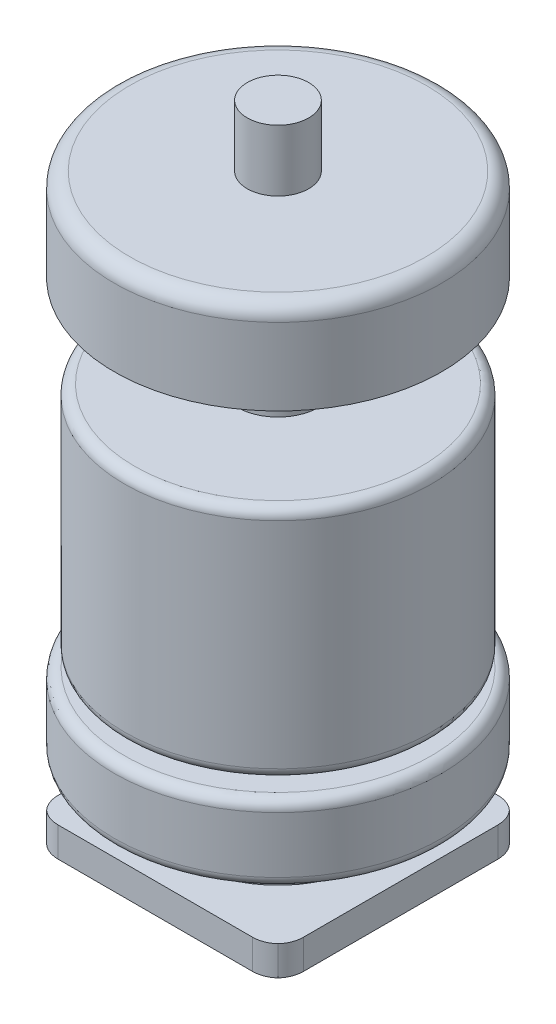
ISO-10303-21;
HEADER;
FILE_DESCRIPTION(('STEP AP214'),'2;1');
FILE_NAME('part.step','',(''),(''),'','','');
FILE_SCHEMA(('AUTOMOTIVE_DESIGN { 1 0 10303 214 1 1 1 1 }'));
ENDSEC;
DATA;
#1=APPLICATION_CONTEXT('core data for automotive mechanical design processes');
#2=APPLICATION_PROTOCOL_DEFINITION('international standard','automotive_design',2000,#1);
#3=PRODUCT_CONTEXT('',#1,'mechanical');
#4=PRODUCT('Part','Part','',(#3));
#5=PRODUCT_RELATED_PRODUCT_CATEGORY('part','',(#4));
#6=PRODUCT_DEFINITION_FORMATION('','',#4);
#7=PRODUCT_DEFINITION_CONTEXT('part definition',#1,'design');
#8=PRODUCT_DEFINITION('design','',#6,#7);
#9=PRODUCT_DEFINITION_SHAPE('','',#8);
#10=(LENGTH_UNIT() NAMED_UNIT(*) SI_UNIT(.MILLI.,.METRE.));
#11=(NAMED_UNIT(*) PLANE_ANGLE_UNIT() SI_UNIT($,.RADIAN.));
#12=(NAMED_UNIT(*) SI_UNIT($,.STERADIAN.) SOLID_ANGLE_UNIT());
#13=UNCERTAINTY_MEASURE_WITH_UNIT(LENGTH_MEASURE(1.E-05),#10,'distance_accuracy_value','');
#14=(GEOMETRIC_REPRESENTATION_CONTEXT(3) GLOBAL_UNCERTAINTY_ASSIGNED_CONTEXT((#13)) GLOBAL_UNIT_ASSIGNED_CONTEXT((#10,
#11,#12)) REPRESENTATION_CONTEXT('',''));
#15=CARTESIAN_POINT('',(0.,0.,0.));
#16=DIRECTION('',(0.,0.,1.));
#17=DIRECTION('',(1.,0.,0.));
#18=AXIS2_PLACEMENT_3D('',#15,#16,#17);
#19=CARTESIAN_POINT('',(4.,7.34943581025671,10.));
#20=DIRECTION('',(0.,1.,0.));
#21=DIRECTION('',(0.,0.,1.));
#22=AXIS2_PLACEMENT_3D('',#19,#20,#21);
#23=PLANE('',#22);
#24=CARTESIAN_POINT('',(0.,7.34943581025671,10.));
#25=DIRECTION('',(0.,1.,0.));
#26=DIRECTION('',(0.,0.,1.));
#27=AXIS2_PLACEMENT_3D('',#24,#25,#26);
#28=CIRCLE('',#27,14.);
#29=CARTESIAN_POINT('',(0.,7.34943581025671,24.));
#30=VERTEX_POINT('',#29);
#31=EDGE_CURVE('E52',#30,#30,#28,.T.);
#32=ORIENTED_EDGE('',*,*,#31,.T.);
#33=EDGE_LOOP('',(#32));
#34=FACE_BOUND('',#33,.T.);
#35=CARTESIAN_POINT('',(0.,7.3494358102567,10.));
#36=DIRECTION('',(0.,1.,0.));
#37=DIRECTION('',(0.,0.,1.));
#38=AXIS2_PLACEMENT_3D('',#35,#36,#37);
#39=CIRCLE('',#38,4.);
#40=CARTESIAN_POINT('',(0.,7.3494358102567,14.));
#41=VERTEX_POINT('',#40);
#42=EDGE_CURVE('E430',#41,#41,#39,.T.);
#43=ORIENTED_EDGE('',*,*,#42,.F.);
#44=EDGE_LOOP('',(#43));
#45=FACE_BOUND('',#44,.T.);
#46=ADVANCED_FACE('F43',(#34,#45),#23,.T.);
#47=CARTESIAN_POINT('',(0.,55.,10.));
#48=DIRECTION('',(0.,1.,0.));
#49=DIRECTION('',(0.,0.,1.));
#50=AXIS2_PLACEMENT_3D('',#47,#48,#49);
#51=CYLINDRICAL_SURFACE('',#50,4.);
#52=ORIENTED_EDGE('',*,*,#42,.T.);
#53=EDGE_LOOP('',(#52));
#54=FACE_BOUND('',#53,.T.);
#55=CARTESIAN_POINT('',(0.,16.3494358102567,10.));
#56=DIRECTION('',(0.,1.,0.));
#57=DIRECTION('',(0.,0.,1.));
#58=AXIS2_PLACEMENT_3D('',#55,#56,#57);
#59=CIRCLE('',#58,4.);
#60=CARTESIAN_POINT('',(0.,16.3494358102567,14.));
#61=VERTEX_POINT('',#60);
#62=EDGE_CURVE('E258',#61,#61,#59,.T.);
#63=ORIENTED_EDGE('',*,*,#62,.F.);
#64=EDGE_LOOP('',(#63));
#65=FACE_BOUND('',#64,.T.);
#66=ADVANCED_FACE('F315',(#54,#65),#51,.T.);
#67=CARTESIAN_POINT('',(4.,16.3494358102567,10.));
#68=DIRECTION('',(0.,-1.,0.));
#69=DIRECTION('',(0.,0.,-1.));
#70=AXIS2_PLACEMENT_3D('',#67,#68,#69);
#71=PLANE('',#70);
#72=CARTESIAN_POINT('',(0.,16.3494358102567,10.));
#73=DIRECTION('',(0.,-1.,0.));
#74=DIRECTION('',(0.,0.,-1.));
#75=AXIS2_PLACEMENT_3D('',#72,#73,#74);
#76=CIRCLE('',#75,16.);
#77=CARTESIAN_POINT('',(0.,16.3494358102567,-6.));
#78=VERTEX_POINT('',#77);
#79=EDGE_CURVE('E254',#78,#78,#76,.F.);
#80=ORIENTED_EDGE('',*,*,#79,.F.);
#81=EDGE_LOOP('',(#80));
#82=FACE_BOUND('',#81,.T.);
#83=ORIENTED_EDGE('',*,*,#62,.T.);
#84=EDGE_LOOP('',(#83));
#85=FACE_BOUND('',#84,.T.);
#86=ADVANCED_FACE('F320',(#82,#85),#71,.T.);
#87=CARTESIAN_POINT('',(0.,31.3494358102567,0.));
#88=DIRECTION('',(0.,-1.,0.));
#89=DIRECTION('',(0.,0.,-1.));
#90=AXIS2_PLACEMENT_3D('',#87,#88,#89);
#91=PLANE('',#90);
#92=CARTESIAN_POINT('',(0.,31.3494358102567,10.));
#93=DIRECTION('',(0.,1.,0.));
#94=DIRECTION('',(0.,0.,1.));
#95=AXIS2_PLACEMENT_3D('',#92,#93,#94);
#96=CIRCLE('',#95,3.);
#97=CARTESIAN_POINT('',(0.,31.3494358102567,13.));
#98=VERTEX_POINT('',#97);
#99=EDGE_CURVE('E172',#98,#98,#96,.T.);
#100=ORIENTED_EDGE('',*,*,#99,.T.);
#101=EDGE_LOOP('',(#100));
#102=FACE_BOUND('',#101,.T.);
#103=ADVANCED_FACE('F326',(#102),#91,.F.);
#104=CARTESIAN_POINT('',(0.,55.,10.));
#105=DIRECTION('',(0.,1.,0.));
#106=DIRECTION('',(0.,0.,1.));
#107=AXIS2_PLACEMENT_3D('',#104,#105,#106);
#108=CYLINDRICAL_SURFACE('',#107,3.);
#109=ORIENTED_EDGE('',*,*,#99,.F.);
#110=EDGE_LOOP('',(#109));
#111=FACE_BOUND('',#110,.T.);
#112=CARTESIAN_POINT('',(0.,25.3494358102567,10.));
#113=DIRECTION('',(0.,1.,0.));
#114=DIRECTION('',(0.,0.,1.));
#115=AXIS2_PLACEMENT_3D('',#112,#113,#114);
#116=CIRCLE('',#115,3.);
#117=CARTESIAN_POINT('',(0.,25.3494358102567,13.));
#118=VERTEX_POINT('',#117);
#119=EDGE_CURVE('E165',#118,#118,#116,.T.);
#120=ORIENTED_EDGE('',*,*,#119,.T.);
#121=EDGE_LOOP('',(#120));
#122=FACE_BOUND('',#121,.T.);
#123=ADVANCED_FACE('F365',(#111,#122),#108,.T.);
#124=CARTESIAN_POINT('',(-3.,25.3494358102567,10.));
#125=DIRECTION('',(0.,-1.,0.));
#126=DIRECTION('',(0.,0.,-1.));
#127=AXIS2_PLACEMENT_3D('',#124,#125,#126);
#128=PLANE('',#127);
#129=CARTESIAN_POINT('',(0.,25.3494358102567,10.));
#130=DIRECTION('',(0.,-1.,0.));
#131=DIRECTION('',(0.,0.,-1.));
#132=AXIS2_PLACEMENT_3D('',#129,#130,#131);
#133=CIRCLE('',#132,14.5);
#134=CARTESIAN_POINT('',(0.,25.3494358102567,-4.5));
#135=VERTEX_POINT('',#134);
#136=EDGE_CURVE('E237',#135,#135,#133,.F.);
#137=ORIENTED_EDGE('',*,*,#136,.T.);
#138=EDGE_LOOP('',(#137));
#139=FACE_BOUND('',#138,.T.);
#140=ORIENTED_EDGE('',*,*,#119,.F.);
#141=EDGE_LOOP('',(#140));
#142=FACE_BOUND('',#141,.T.);
#143=ADVANCED_FACE('F362',(#139,#142),#128,.F.);
#144=CARTESIAN_POINT('',(0.,31.3494358102567,10.));
#145=DIRECTION('',(0.,1.,0.));
#146=DIRECTION('',(0.,0.,1.));
#147=AXIS2_PLACEMENT_3D('',#144,#145,#146);
#148=CYLINDRICAL_SURFACE('',#147,16.);
#149=CARTESIAN_POINT('',(0.,23.8494358102567,10.));
#150=DIRECTION('',(0.,-1.,0.));
#151=DIRECTION('',(0.,0.,-1.));
#152=AXIS2_PLACEMENT_3D('',#149,#150,#151);
#153=CIRCLE('',#152,16.);
#154=CARTESIAN_POINT('',(0.,23.8494358102567,-6.));
#155=VERTEX_POINT('',#154);
#156=EDGE_CURVE('E262',#155,#155,#153,.T.);
#157=ORIENTED_EDGE('',*,*,#156,.T.);
#158=EDGE_LOOP('',(#157));
#159=FACE_BOUND('',#158,.T.);
#160=ORIENTED_EDGE('',*,*,#79,.T.);
#161=EDGE_LOOP('',(#160));
#162=FACE_BOUND('',#161,.T.);
#163=ADVANCED_FACE('F305',(#159,#162),#148,.T.);
#164=CARTESIAN_POINT('',(0.,55.,10.));
#165=DIRECTION('',(0.,1.,0.));
#166=DIRECTION('',(0.,0.,1.));
#167=AXIS2_PLACEMENT_3D('',#164,#165,#166);
#168=CYLINDRICAL_SURFACE('',#167,15.);
#169=CARTESIAN_POINT('',(0.,6.3494358102567,10.));
#170=DIRECTION('',(0.,1.,0.));
#171=DIRECTION('',(0.,0.,1.));
#172=AXIS2_PLACEMENT_3D('',#169,#170,#171);
#173=CIRCLE('',#172,15.);
#174=CARTESIAN_POINT('',(0.,6.3494358102567,25.));
#175=VERTEX_POINT('',#174);
#176=EDGE_CURVE('E286',#175,#175,#173,.F.);
#177=ORIENTED_EDGE('',*,*,#176,.T.);
#178=EDGE_LOOP('',(#177));
#179=FACE_BOUND('',#178,.T.);
#180=CARTESIAN_POINT('',(0.,-14.6505641897433,10.));
#181=DIRECTION('',(0.,1.,0.));
#182=DIRECTION('',(0.,0.,1.));
#183=AXIS2_PLACEMENT_3D('',#180,#181,#182);
#184=CIRCLE('',#183,15.);
#185=CARTESIAN_POINT('',(0.,-14.6505641897433,25.));
#186=VERTEX_POINT('',#185);
#187=EDGE_CURVE('E282',#186,#186,#184,.T.);
#188=ORIENTED_EDGE('',*,*,#187,.T.);
#189=EDGE_LOOP('',(#188));
#190=FACE_BOUND('',#189,.T.);
#191=ADVANCED_FACE('F301',(#179,#190),#168,.T.);
#192=CARTESIAN_POINT('',(-9.,-15.6505641897433,10.));
#193=DIRECTION('',(0.,1.,0.));
#194=DIRECTION('',(0.,0.,1.));
#195=AXIS2_PLACEMENT_3D('',#192,#193,#194);
#196=PLANE('',#195);
#197=CARTESIAN_POINT('',(0.,-15.6505641897433,10.));
#198=DIRECTION('',(0.,1.,0.));
#199=DIRECTION('',(0.,0.,1.));
#200=AXIS2_PLACEMENT_3D('',#197,#198,#199);
#201=CIRCLE('',#200,14.);
#202=CARTESIAN_POINT('',(0.,-15.6505641897433,24.));
#203=VERTEX_POINT('',#202);
#204=EDGE_CURVE('E11',#203,#203,#201,.F.);
#205=ORIENTED_EDGE('',*,*,#204,.T.);
#206=EDGE_LOOP('',(#205));
#207=FACE_BOUND('',#206,.T.);
#208=CARTESIAN_POINT('',(0.,-15.6505641897433,10.));
#209=DIRECTION('',(0.,1.,0.));
#210=DIRECTION('',(0.,0.,1.));
#211=AXIS2_PLACEMENT_3D('',#208,#209,#210);
#212=CIRCLE('',#211,9.);
#213=CARTESIAN_POINT('',(0.,-15.6505641897433,19.));
#214=VERTEX_POINT('',#213);
#215=EDGE_CURVE('E426',#214,#214,#212,.T.);
#216=ORIENTED_EDGE('',*,*,#215,.T.);
#217=EDGE_LOOP('',(#216));
#218=FACE_BOUND('',#217,.T.);
#219=ADVANCED_FACE('F304',(#207,#218),#196,.F.);
#220=CARTESIAN_POINT('',(0.,55.,10.));
#221=DIRECTION('',(0.,1.,0.));
#222=DIRECTION('',(0.,0.,1.));
#223=AXIS2_PLACEMENT_3D('',#220,#221,#222);
#224=CYLINDRICAL_SURFACE('',#223,9.);
#225=ORIENTED_EDGE('',*,*,#215,.F.);
#226=EDGE_LOOP('',(#225));
#227=FACE_BOUND('',#226,.T.);
#228=CARTESIAN_POINT('',(0.,-16.6505641897433,10.));
#229=DIRECTION('',(0.,1.,0.));
#230=DIRECTION('',(0.,0.,1.));
#231=AXIS2_PLACEMENT_3D('',#228,#229,#230);
#232=CIRCLE('',#231,9.);
#233=CARTESIAN_POINT('',(0.,-16.6505641897433,19.));
#234=VERTEX_POINT('',#233);
#235=EDGE_CURVE('E423',#234,#234,#232,.T.);
#236=ORIENTED_EDGE('',*,*,#235,.T.);
#237=EDGE_LOOP('',(#236));
#238=FACE_BOUND('',#237,.T.);
#239=ADVANCED_FACE('F372',(#227,#238),#224,.T.);
#240=CARTESIAN_POINT('',(0.,-31.6505641897433,0.));
#241=DIRECTION('',(0.,-1.,0.));
#242=DIRECTION('',(0.,0.,-1.));
#243=AXIS2_PLACEMENT_3D('',#240,#241,#242);
#244=PLANE('',#243);
#245=DIRECTION('',(0.,0.,-1.));
#246=VECTOR('',#245,1.);
#247=CARTESIAN_POINT('',(-12.,-31.6505641897433,0.));
#248=LINE('',#247,#246);
#249=CARTESIAN_POINT('',(-12.,-31.6505641897433,19.5078914592038));
#250=VERTEX_POINT('',#249);
#251=CARTESIAN_POINT('',(-12.,-31.6505641897433,0.492108540796227));
#252=VERTEX_POINT('',#251);
#253=EDGE_CURVE('E143',#250,#252,#248,.T.);
#254=ORIENTED_EDGE('',*,*,#253,.T.);
#255=CARTESIAN_POINT('',(-9.3,-31.6505641897433,0.492108540796227));
#256=DIRECTION('',(0.,-1.,0.));
#257=DIRECTION('',(0.,0.,-1.));
#258=AXIS2_PLACEMENT_3D('',#255,#256,#257);
#259=CIRCLE('',#258,2.7);
#260=CARTESIAN_POINT('',(-11.3103022768662,-31.6505641897433,-1.3103022768662));
#261=VERTEX_POINT('',#260);
#262=EDGE_CURVE('E191',#252,#261,#259,.T.);
#263=ORIENTED_EDGE('',*,*,#262,.T.);
#264=CARTESIAN_POINT('',(-9.50789145920377,-31.6505641897433,0.699999999999999));
#265=DIRECTION('',(0.,-1.,0.));
#266=DIRECTION('',(0.,0.,-1.));
#267=AXIS2_PLACEMENT_3D('',#264,#265,#266);
#268=CIRCLE('',#267,2.7);
#269=CARTESIAN_POINT('',(-9.50789145920377,-31.6505641897433,-2.));
#270=VERTEX_POINT('',#269);
#271=EDGE_CURVE('E188',#261,#270,#268,.T.);
#272=ORIENTED_EDGE('',*,*,#271,.T.);
#273=DIRECTION('',(-1.,0.,0.));
#274=VECTOR('',#273,1.);
#275=CARTESIAN_POINT('',(0.,-31.6505641897433,-2.));
#276=LINE('',#275,#274);
#277=CARTESIAN_POINT('',(9.50789145920377,-31.6505641897433,-2.));
#278=VERTEX_POINT('',#277);
#279=EDGE_CURVE('E463',#278,#270,#276,.T.);
#280=ORIENTED_EDGE('',*,*,#279,.F.);
#281=CARTESIAN_POINT('',(9.50789145920377,-31.6505641897433,0.699999999999999));
#282=DIRECTION('',(0.,-1.,0.));
#283=DIRECTION('',(0.,0.,-1.));
#284=AXIS2_PLACEMENT_3D('',#281,#282,#283);
#285=CIRCLE('',#284,2.7);
#286=CARTESIAN_POINT('',(11.3103022768662,-31.6505641897433,-1.3103022768662));
#287=VERTEX_POINT('',#286);
#288=EDGE_CURVE('E178',#278,#287,#285,.T.);
#289=ORIENTED_EDGE('',*,*,#288,.T.);
#290=CARTESIAN_POINT('',(9.3,-31.6505641897433,0.492108540796227));
#291=DIRECTION('',(0.,-1.,0.));
#292=DIRECTION('',(0.,0.,-1.));
#293=AXIS2_PLACEMENT_3D('',#290,#291,#292);
#294=CIRCLE('',#293,2.7);
#295=CARTESIAN_POINT('',(12.,-31.6505641897433,0.492108540796227));
#296=VERTEX_POINT('',#295);
#297=EDGE_CURVE('E169',#287,#296,#294,.T.);
#298=ORIENTED_EDGE('',*,*,#297,.T.);
#299=DIRECTION('',(0.,0.,-1.));
#300=VECTOR('',#299,1.);
#301=CARTESIAN_POINT('',(12.,-31.6505641897433,0.));
#302=LINE('',#301,#300);
#303=CARTESIAN_POINT('',(12.,-31.6505641897433,19.5078914592038));
#304=VERTEX_POINT('',#303);
#305=EDGE_CURVE('E456',#304,#296,#302,.T.);
#306=ORIENTED_EDGE('',*,*,#305,.F.);
#307=CARTESIAN_POINT('',(9.3,-31.6505641897433,19.5078914592038));
#308=DIRECTION('',(0.,-1.,0.));
#309=DIRECTION('',(0.,0.,-1.));
#310=AXIS2_PLACEMENT_3D('',#307,#308,#309);
#311=CIRCLE('',#310,2.7);
#312=CARTESIAN_POINT('',(11.3103022768662,-31.6505641897433,21.3103022768662));
#313=VERTEX_POINT('',#312);
#314=EDGE_CURVE('E181',#304,#313,#311,.T.);
#315=ORIENTED_EDGE('',*,*,#314,.T.);
#316=CARTESIAN_POINT('',(9.50789145920377,-31.6505641897433,19.3));
#317=DIRECTION('',(0.,-1.,0.));
#318=DIRECTION('',(0.,0.,-1.));
#319=AXIS2_PLACEMENT_3D('',#316,#317,#318);
#320=CIRCLE('',#319,2.7);
#321=CARTESIAN_POINT('',(9.50789145920377,-31.6505641897433,22.));
#322=VERTEX_POINT('',#321);
#323=EDGE_CURVE('E150',#313,#322,#320,.T.);
#324=ORIENTED_EDGE('',*,*,#323,.T.);
#325=DIRECTION('',(-1.,0.,0.));
#326=VECTOR('',#325,1.);
#327=CARTESIAN_POINT('',(0.,-31.6505641897433,22.));
#328=LINE('',#327,#326);
#329=CARTESIAN_POINT('',(-9.50789145920377,-31.6505641897433,22.));
#330=VERTEX_POINT('',#329);
#331=EDGE_CURVE('E449',#322,#330,#328,.T.);
#332=ORIENTED_EDGE('',*,*,#331,.T.);
#333=CARTESIAN_POINT('',(-9.50789145920377,-31.6505641897433,19.3));
#334=DIRECTION('',(0.,-1.,0.));
#335=DIRECTION('',(0.,0.,-1.));
#336=AXIS2_PLACEMENT_3D('',#333,#334,#335);
#337=CIRCLE('',#336,2.7);
#338=CARTESIAN_POINT('',(-11.3103022768662,-31.6505641897433,21.3103022768662));
#339=VERTEX_POINT('',#338);
#340=EDGE_CURVE('E145',#330,#339,#337,.T.);
#341=ORIENTED_EDGE('',*,*,#340,.T.);
#342=CARTESIAN_POINT('',(-9.3,-31.6505641897433,19.5078914592038));
#343=DIRECTION('',(0.,-1.,0.));
#344=DIRECTION('',(0.,0.,-1.));
#345=AXIS2_PLACEMENT_3D('',#342,#343,#344);
#346=CIRCLE('',#345,2.7);
#347=EDGE_CURVE('E140',#339,#250,#346,.T.);
#348=ORIENTED_EDGE('',*,*,#347,.T.);
#349=EDGE_LOOP('',(#254,#263,#272,#280,#289,#298,#306,#315,#324,#332,#341,#348));
#350=FACE_BOUND('',#349,.T.);
#351=ADVANCED_FACE('F142',(#350),#244,.T.);
#352=CARTESIAN_POINT('',(0.,-28.7505641897433,-2.));
#353=DIRECTION('',(0.,0.,1.));
#354=DIRECTION('',(0.,-1.,0.));
#355=AXIS2_PLACEMENT_3D('',#352,#353,#354);
#356=PLANE('',#355);
#357=ORIENTED_EDGE('',*,*,#279,.T.);
#358=DIRECTION('',(0.,-1.,0.));
#359=VECTOR('',#358,1.);
#360=CARTESIAN_POINT('',(-9.50789145920377,-28.7505641897433,-2.));
#361=LINE('',#360,#359);
#362=CARTESIAN_POINT('',(-9.50789145920377,-28.7505641897433,-2.));
#363=VERTEX_POINT('',#362);
#364=EDGE_CURVE('E220',#270,#363,#361,.F.);
#365=ORIENTED_EDGE('',*,*,#364,.T.);
#366=DIRECTION('',(-1.,0.,0.));
#367=VECTOR('',#366,1.);
#368=CARTESIAN_POINT('',(0.,-28.7505641897433,-2.));
#369=LINE('',#368,#367);
#370=CARTESIAN_POINT('',(9.50789145920377,-28.7505641897433,-2.));
#371=VERTEX_POINT('',#370);
#372=EDGE_CURVE('E460',#371,#363,#369,.T.);
#373=ORIENTED_EDGE('',*,*,#372,.F.);
#374=DIRECTION('',(0.,-1.,0.));
#375=VECTOR('',#374,1.);
#376=CARTESIAN_POINT('',(9.50789145920377,-31.6505641897433,-2.));
#377=LINE('',#376,#375);
#378=EDGE_CURVE('E216',#371,#278,#377,.T.);
#379=ORIENTED_EDGE('',*,*,#378,.T.);
#380=EDGE_LOOP('',(#357,#365,#373,#379));
#381=FACE_BOUND('',#380,.T.);
#382=ADVANCED_FACE('F354',(#381),#356,.F.);
#383=CARTESIAN_POINT('',(9.50789145920377,31.3494358102567,0.700000000000003));
#384=DIRECTION('',(0.,1.,0.));
#385=DIRECTION('',(0.,0.,1.));
#386=AXIS2_PLACEMENT_3D('',#383,#384,#385);
#387=CYLINDRICAL_SURFACE('',#386,2.7);
#388=CARTESIAN_POINT('',(9.50789145920377,-28.7505641897433,0.699999999999999));
#389=DIRECTION('',(0.,-1.,0.));
#390=DIRECTION('',(0.,0.,-1.));
#391=AXIS2_PLACEMENT_3D('',#388,#389,#390);
#392=CIRCLE('',#391,2.7);
#393=CARTESIAN_POINT('',(11.3103022768662,-28.7505641897433,-1.3103022768662));
#394=VERTEX_POINT('',#393);
#395=EDGE_CURVE('E197',#394,#371,#392,.F.);
#396=ORIENTED_EDGE('',*,*,#395,.F.);
#397=DIRECTION('',(0.,1.,0.));
#398=VECTOR('',#397,1.);
#399=CARTESIAN_POINT('',(11.3103022768662,-30.2005641897433,-1.3103022768662));
#400=LINE('',#399,#398);
#401=EDGE_CURVE('E250',#394,#287,#400,.F.);
#402=ORIENTED_EDGE('',*,*,#401,.T.);
#403=ORIENTED_EDGE('',*,*,#288,.F.);
#404=ORIENTED_EDGE('',*,*,#378,.F.);
#405=EDGE_LOOP('',(#396,#402,#403,#404));
#406=FACE_BOUND('',#405,.T.);
#407=ADVANCED_FACE('F357',(#406),#387,.T.);
#408=CARTESIAN_POINT('',(9.3,31.3494358102567,0.492108540796231));
#409=DIRECTION('',(0.,1.,0.));
#410=DIRECTION('',(0.,0.,1.));
#411=AXIS2_PLACEMENT_3D('',#408,#409,#410);
#412=CYLINDRICAL_SURFACE('',#411,2.7);
#413=ORIENTED_EDGE('',*,*,#401,.F.);
#414=CARTESIAN_POINT('',(9.3,-28.7505641897433,0.492108540796227));
#415=DIRECTION('',(0.,-1.,0.));
#416=DIRECTION('',(0.,0.,-1.));
#417=AXIS2_PLACEMENT_3D('',#414,#415,#416);
#418=CIRCLE('',#417,2.7);
#419=CARTESIAN_POINT('',(12.,-28.7505641897433,0.492108540796227));
#420=VERTEX_POINT('',#419);
#421=EDGE_CURVE('E194',#420,#394,#418,.F.);
#422=ORIENTED_EDGE('',*,*,#421,.F.);
#423=DIRECTION('',(0.,-1.,0.));
#424=VECTOR('',#423,1.);
#425=CARTESIAN_POINT('',(12.,-28.7505641897433,0.492108540796227));
#426=LINE('',#425,#424);
#427=EDGE_CURVE('E231',#296,#420,#426,.F.);
#428=ORIENTED_EDGE('',*,*,#427,.F.);
#429=ORIENTED_EDGE('',*,*,#297,.F.);
#430=EDGE_LOOP('',(#413,#422,#428,#429));
#431=FACE_BOUND('',#430,.T.);
#432=ADVANCED_FACE('F352',(#431),#412,.T.);
#433=CARTESIAN_POINT('',(12.,-28.7505641897433,0.));
#434=DIRECTION('',(-1.,0.,0.));
#435=DIRECTION('',(0.,0.,1.));
#436=AXIS2_PLACEMENT_3D('',#433,#434,#435);
#437=PLANE('',#436);
#438=DIRECTION('',(0.,0.,-1.));
#439=VECTOR('',#438,1.);
#440=CARTESIAN_POINT('',(12.,-28.7505641897433,0.));
#441=LINE('',#440,#439);
#442=CARTESIAN_POINT('',(12.,-28.7505641897433,19.5078914592038));
#443=VERTEX_POINT('',#442);
#444=EDGE_CURVE('E452',#443,#420,#441,.T.);
#445=ORIENTED_EDGE('',*,*,#444,.F.);
#446=DIRECTION('',(0.,-1.,0.));
#447=VECTOR('',#446,1.);
#448=CARTESIAN_POINT('',(12.,-31.6505641897433,19.5078914592038));
#449=LINE('',#448,#447);
#450=EDGE_CURVE('E234',#443,#304,#449,.T.);
#451=ORIENTED_EDGE('',*,*,#450,.T.);
#452=ORIENTED_EDGE('',*,*,#305,.T.);
#453=ORIENTED_EDGE('',*,*,#427,.T.);
#454=EDGE_LOOP('',(#445,#451,#452,#453));
#455=FACE_BOUND('',#454,.T.);
#456=ADVANCED_FACE('F348',(#455),#437,.F.);
#457=CARTESIAN_POINT('',(9.3,31.3494358102567,19.5078914592038));
#458=DIRECTION('',(0.,1.,0.));
#459=DIRECTION('',(0.,0.,1.));
#460=AXIS2_PLACEMENT_3D('',#457,#458,#459);
#461=CYLINDRICAL_SURFACE('',#460,2.7);
#462=ORIENTED_EDGE('',*,*,#450,.F.);
#463=CARTESIAN_POINT('',(9.3,-28.7505641897433,19.5078914592038));
#464=DIRECTION('',(0.,-1.,0.));
#465=DIRECTION('',(0.,0.,-1.));
#466=AXIS2_PLACEMENT_3D('',#463,#464,#465);
#467=CIRCLE('',#466,2.7);
#468=CARTESIAN_POINT('',(11.3103022768662,-28.7505641897433,21.3103022768662));
#469=VERTEX_POINT('',#468);
#470=EDGE_CURVE('E200',#469,#443,#467,.F.);
#471=ORIENTED_EDGE('',*,*,#470,.F.);
#472=DIRECTION('',(0.,1.,0.));
#473=VECTOR('',#472,1.);
#474=CARTESIAN_POINT('',(11.3103022768662,-30.2005641897433,21.3103022768662));
#475=LINE('',#474,#473);
#476=EDGE_CURVE('E246',#313,#469,#475,.T.);
#477=ORIENTED_EDGE('',*,*,#476,.F.);
#478=ORIENTED_EDGE('',*,*,#314,.F.);
#479=EDGE_LOOP('',(#462,#471,#477,#478));
#480=FACE_BOUND('',#479,.T.);
#481=ADVANCED_FACE('F351',(#480),#461,.T.);
#482=CARTESIAN_POINT('',(9.50789145920377,31.3494358102567,19.3));
#483=DIRECTION('',(0.,1.,0.));
#484=DIRECTION('',(0.,0.,1.));
#485=AXIS2_PLACEMENT_3D('',#482,#483,#484);
#486=CYLINDRICAL_SURFACE('',#485,2.7);
#487=CARTESIAN_POINT('',(9.50789145920377,-28.7505641897433,19.3));
#488=DIRECTION('',(0.,-1.,0.));
#489=DIRECTION('',(0.,0.,-1.));
#490=AXIS2_PLACEMENT_3D('',#487,#488,#489);
#491=CIRCLE('',#490,2.7);
#492=CARTESIAN_POINT('',(9.50789145920377,-28.7505641897433,22.));
#493=VERTEX_POINT('',#492);
#494=EDGE_CURVE('E203',#493,#469,#491,.F.);
#495=ORIENTED_EDGE('',*,*,#494,.F.);
#496=DIRECTION('',(0.,1.,0.));
#497=VECTOR('',#496,1.);
#498=CARTESIAN_POINT('',(9.50789145920377,-28.7505641897433,22.));
#499=LINE('',#498,#497);
#500=EDGE_CURVE('E223',#322,#493,#499,.T.);
#501=ORIENTED_EDGE('',*,*,#500,.F.);
#502=ORIENTED_EDGE('',*,*,#323,.F.);
#503=ORIENTED_EDGE('',*,*,#476,.T.);
#504=EDGE_LOOP('',(#495,#501,#502,#503));
#505=FACE_BOUND('',#504,.T.);
#506=ADVANCED_FACE('F346',(#505),#486,.T.);
#507=CARTESIAN_POINT('',(0.,-28.7505641897433,22.));
#508=DIRECTION('',(0.,0.,1.));
#509=DIRECTION('',(0.,-1.,0.));
#510=AXIS2_PLACEMENT_3D('',#507,#508,#509);
#511=PLANE('',#510);
#512=DIRECTION('',(-1.,0.,0.));
#513=VECTOR('',#512,1.);
#514=CARTESIAN_POINT('',(0.,-28.7505641897433,22.));
#515=LINE('',#514,#513);
#516=CARTESIAN_POINT('',(-9.50789145920377,-28.7505641897433,22.));
#517=VERTEX_POINT('',#516);
#518=EDGE_CURVE('E445',#493,#517,#515,.T.);
#519=ORIENTED_EDGE('',*,*,#518,.T.);
#520=DIRECTION('',(0.,1.,0.));
#521=VECTOR('',#520,1.);
#522=CARTESIAN_POINT('',(-9.50789145920377,-28.7505641897433,22.));
#523=LINE('',#522,#521);
#524=EDGE_CURVE('E227',#517,#330,#523,.F.);
#525=ORIENTED_EDGE('',*,*,#524,.T.);
#526=ORIENTED_EDGE('',*,*,#331,.F.);
#527=ORIENTED_EDGE('',*,*,#500,.T.);
#528=EDGE_LOOP('',(#519,#525,#526,#527));
#529=FACE_BOUND('',#528,.T.);
#530=ADVANCED_FACE('F342',(#529),#511,.T.);
#531=CARTESIAN_POINT('',(-9.50789145920377,31.3494358102567,19.3));
#532=DIRECTION('',(0.,1.,0.));
#533=DIRECTION('',(0.,0.,1.));
#534=AXIS2_PLACEMENT_3D('',#531,#532,#533);
#535=CYLINDRICAL_SURFACE('',#534,2.7);
#536=CARTESIAN_POINT('',(-9.50789145920377,-28.7505641897433,19.3));
#537=DIRECTION('',(0.,-1.,0.));
#538=DIRECTION('',(0.,0.,-1.));
#539=AXIS2_PLACEMENT_3D('',#536,#537,#538);
#540=CIRCLE('',#539,2.7);
#541=CARTESIAN_POINT('',(-11.3103022768662,-28.7505641897433,21.3103022768662));
#542=VERTEX_POINT('',#541);
#543=EDGE_CURVE('E208',#542,#517,#540,.F.);
#544=ORIENTED_EDGE('',*,*,#543,.F.);
#545=DIRECTION('',(0.,1.,0.));
#546=VECTOR('',#545,1.);
#547=CARTESIAN_POINT('',(-11.3103022768662,-30.2005641897433,21.3103022768662));
#548=LINE('',#547,#546);
#549=EDGE_CURVE('E243',#542,#339,#548,.F.);
#550=ORIENTED_EDGE('',*,*,#549,.T.);
#551=ORIENTED_EDGE('',*,*,#340,.F.);
#552=ORIENTED_EDGE('',*,*,#524,.F.);
#553=EDGE_LOOP('',(#544,#550,#551,#552));
#554=FACE_BOUND('',#553,.T.);
#555=ADVANCED_FACE('F345',(#554),#535,.T.);
#556=CARTESIAN_POINT('',(-9.3,31.3494358102567,19.5078914592038));
#557=DIRECTION('',(0.,1.,0.));
#558=DIRECTION('',(0.,0.,1.));
#559=AXIS2_PLACEMENT_3D('',#556,#557,#558);
#560=CYLINDRICAL_SURFACE('',#559,2.7);
#561=ORIENTED_EDGE('',*,*,#549,.F.);
#562=CARTESIAN_POINT('',(-9.3,-28.7505641897433,19.5078914592038));
#563=DIRECTION('',(0.,-1.,0.));
#564=DIRECTION('',(0.,0.,-1.));
#565=AXIS2_PLACEMENT_3D('',#562,#563,#564);
#566=CIRCLE('',#565,2.7);
#567=CARTESIAN_POINT('',(-12.,-28.7505641897433,19.5078914592038));
#568=VERTEX_POINT('',#567);
#569=EDGE_CURVE('E71',#568,#542,#566,.F.);
#570=ORIENTED_EDGE('',*,*,#569,.F.);
#571=DIRECTION('',(0.,1.,0.));
#572=VECTOR('',#571,1.);
#573=CARTESIAN_POINT('',(-12.,-28.7505641897433,19.5078914592038));
#574=LINE('',#573,#572);
#575=EDGE_CURVE('E156',#250,#568,#574,.T.);
#576=ORIENTED_EDGE('',*,*,#575,.F.);
#577=ORIENTED_EDGE('',*,*,#347,.F.);
#578=EDGE_LOOP('',(#561,#570,#576,#577));
#579=FACE_BOUND('',#578,.T.);
#580=ADVANCED_FACE('F163',(#579),#560,.T.);
#581=CARTESIAN_POINT('',(-12.,-28.7505641897433,0.));
#582=DIRECTION('',(-1.,0.,0.));
#583=DIRECTION('',(0.,0.,1.));
#584=AXIS2_PLACEMENT_3D('',#581,#582,#583);
#585=PLANE('',#584);
#586=DIRECTION('',(0.,0.,-1.));
#587=VECTOR('',#586,1.);
#588=CARTESIAN_POINT('',(-12.,-28.7505641897433,0.));
#589=LINE('',#588,#587);
#590=CARTESIAN_POINT('',(-12.,-28.7505641897433,0.492108540796227));
#591=VERTEX_POINT('',#590);
#592=EDGE_CURVE('E160',#568,#591,#589,.T.);
#593=ORIENTED_EDGE('',*,*,#592,.T.);
#594=DIRECTION('',(0.,1.,0.));
#595=VECTOR('',#594,1.);
#596=CARTESIAN_POINT('',(-12.,-28.7505641897433,0.492108540796227));
#597=LINE('',#596,#595);
#598=EDGE_CURVE('E158',#591,#252,#597,.F.);
#599=ORIENTED_EDGE('',*,*,#598,.T.);
#600=ORIENTED_EDGE('',*,*,#253,.F.);
#601=ORIENTED_EDGE('',*,*,#575,.T.);
#602=EDGE_LOOP('',(#593,#599,#600,#601));
#603=FACE_BOUND('',#602,.T.);
#604=ADVANCED_FACE('F155',(#603),#585,.T.);
#605=CARTESIAN_POINT('',(-9.3,31.3494358102567,0.492108540796231));
#606=DIRECTION('',(0.,1.,0.));
#607=DIRECTION('',(0.,0.,1.));
#608=AXIS2_PLACEMENT_3D('',#605,#606,#607);
#609=CYLINDRICAL_SURFACE('',#608,2.7);
#610=CARTESIAN_POINT('',(-9.3,-28.7505641897433,0.492108540796227));
#611=DIRECTION('',(0.,-1.,0.));
#612=DIRECTION('',(0.,0.,-1.));
#613=AXIS2_PLACEMENT_3D('',#610,#611,#612);
#614=CIRCLE('',#613,2.7);
#615=CARTESIAN_POINT('',(-11.3103022768662,-28.7505641897433,-1.3103022768662));
#616=VERTEX_POINT('',#615);
#617=EDGE_CURVE('E213',#616,#591,#614,.F.);
#618=ORIENTED_EDGE('',*,*,#617,.F.);
#619=DIRECTION('',(0.,1.,0.));
#620=VECTOR('',#619,1.);
#621=CARTESIAN_POINT('',(-11.3103022768662,-30.2005641897433,-1.3103022768662));
#622=LINE('',#621,#620);
#623=EDGE_CURVE('E238',#616,#261,#622,.F.);
#624=ORIENTED_EDGE('',*,*,#623,.T.);
#625=ORIENTED_EDGE('',*,*,#262,.F.);
#626=ORIENTED_EDGE('',*,*,#598,.F.);
#627=EDGE_LOOP('',(#618,#624,#625,#626));
#628=FACE_BOUND('',#627,.T.);
#629=ADVANCED_FACE('F361',(#628),#609,.T.);
#630=CARTESIAN_POINT('',(-9.50789145920377,31.3494358102567,0.700000000000003));
#631=DIRECTION('',(0.,1.,0.));
#632=DIRECTION('',(0.,0.,1.));
#633=AXIS2_PLACEMENT_3D('',#630,#631,#632);
#634=CYLINDRICAL_SURFACE('',#633,2.7);
#635=ORIENTED_EDGE('',*,*,#623,.F.);
#636=CARTESIAN_POINT('',(-9.50789145920377,-28.7505641897433,0.699999999999999));
#637=DIRECTION('',(0.,-1.,0.));
#638=DIRECTION('',(0.,0.,-1.));
#639=AXIS2_PLACEMENT_3D('',#636,#637,#638);
#640=CIRCLE('',#639,2.7);
#641=EDGE_CURVE('E62',#363,#616,#640,.F.);
#642=ORIENTED_EDGE('',*,*,#641,.F.);
#643=ORIENTED_EDGE('',*,*,#364,.F.);
#644=ORIENTED_EDGE('',*,*,#271,.F.);
#645=EDGE_LOOP('',(#635,#642,#643,#644));
#646=FACE_BOUND('',#645,.T.);
#647=ADVANCED_FACE('F333',(#646),#634,.T.);
#648=CARTESIAN_POINT('',(-9.,-28.7505641897433,10.));
#649=DIRECTION('',(0.,-1.,0.));
#650=DIRECTION('',(0.,0.,-1.));
#651=AXIS2_PLACEMENT_3D('',#648,#649,#650);
#652=PLANE('',#651);
#653=ORIENTED_EDGE('',*,*,#641,.T.);
#654=ORIENTED_EDGE('',*,*,#617,.T.);
#655=ORIENTED_EDGE('',*,*,#592,.F.);
#656=ORIENTED_EDGE('',*,*,#569,.T.);
#657=ORIENTED_EDGE('',*,*,#543,.T.);
#658=ORIENTED_EDGE('',*,*,#518,.F.);
#659=ORIENTED_EDGE('',*,*,#494,.T.);
#660=ORIENTED_EDGE('',*,*,#470,.T.);
#661=ORIENTED_EDGE('',*,*,#444,.T.);
#662=ORIENTED_EDGE('',*,*,#421,.T.);
#663=ORIENTED_EDGE('',*,*,#395,.T.);
#664=ORIENTED_EDGE('',*,*,#372,.T.);
#665=EDGE_LOOP('',(#653,#654,#655,#656,#657,#658,#659,#660,#661,#662,#663,#664));
#666=FACE_BOUND('',#665,.T.);
#667=CARTESIAN_POINT('',(0.,-28.7505641897433,10.));
#668=DIRECTION('',(0.,1.,0.));
#669=DIRECTION('',(0.,0.,1.));
#670=AXIS2_PLACEMENT_3D('',#667,#668,#669);
#671=CIRCLE('',#670,9.);
#672=CARTESIAN_POINT('',(0.,-28.7505641897433,19.));
#673=VERTEX_POINT('',#672);
#674=EDGE_CURVE('E242',#673,#673,#671,.T.);
#675=ORIENTED_EDGE('',*,*,#674,.F.);
#676=EDGE_LOOP('',(#675));
#677=FACE_BOUND('',#676,.T.);
#678=ADVANCED_FACE('F329',(#666,#677),#652,.F.);
#679=CARTESIAN_POINT('',(0.,55.,10.));
#680=DIRECTION('',(0.,1.,0.));
#681=DIRECTION('',(0.,0.,1.));
#682=AXIS2_PLACEMENT_3D('',#679,#680,#681);
#683=CYLINDRICAL_SURFACE('',#682,9.);
#684=CARTESIAN_POINT('',(0.,-24.1451016141328,10.));
#685=DIRECTION('',(0.,1.,0.));
#686=DIRECTION('',(0.,0.,1.));
#687=AXIS2_PLACEMENT_3D('',#684,#685,#686);
#688=CIRCLE('',#687,9.);
#689=CARTESIAN_POINT('',(0.,-24.1451016141328,19.));
#690=VERTEX_POINT('',#689);
#691=EDGE_CURVE('E161',#690,#690,#688,.T.);
#692=ORIENTED_EDGE('',*,*,#691,.F.);
#693=EDGE_LOOP('',(#692));
#694=FACE_BOUND('',#693,.T.);
#695=ORIENTED_EDGE('',*,*,#674,.T.);
#696=EDGE_LOOP('',(#695));
#697=FACE_BOUND('',#696,.T.);
#698=ADVANCED_FACE('F332',(#694,#697),#683,.T.);
#699=CARTESIAN_POINT('',(-9.,-24.1451016141329,10.));
#700=DIRECTION('',(0.,1.,0.));
#701=DIRECTION('',(0.,0.,1.));
#702=AXIS2_PLACEMENT_3D('',#699,#700,#701);
#703=PLANE('',#702);
#704=CARTESIAN_POINT('',(0.,-24.1451016141329,10.));
#705=DIRECTION('',(0.,1.,0.));
#706=DIRECTION('',(0.,0.,1.));
#707=AXIS2_PLACEMENT_3D('',#704,#705,#706);
#708=CIRCLE('',#707,15.);
#709=CARTESIAN_POINT('',(0.,-24.1451016141329,25.));
#710=VERTEX_POINT('',#709);
#711=EDGE_CURVE('E266',#710,#710,#708,.F.);
#712=ORIENTED_EDGE('',*,*,#711,.T.);
#713=EDGE_LOOP('',(#712));
#714=FACE_BOUND('',#713,.T.);
#715=ORIENTED_EDGE('',*,*,#691,.T.);
#716=EDGE_LOOP('',(#715));
#717=FACE_BOUND('',#716,.T.);
#718=ADVANCED_FACE('F334',(#714,#717),#703,.F.);
#719=CARTESIAN_POINT('',(0.,-23.1451016141329,10.));
#720=DIRECTION('',(0.,1.,0.));
#721=DIRECTION('',(0.,0.,1.));
#722=AXIS2_PLACEMENT_3D('',#719,#720,#721);
#723=CIRCLE('',#722,16.);
#724=CARTESIAN_POINT('',(0.,-23.1451016141329,26.));
#725=VERTEX_POINT('',#724);
#726=EDGE_CURVE('E274',#725,#725,#723,.T.);
#727=ORIENTED_EDGE('',*,*,#726,.T.);
#728=EDGE_LOOP('',(#727));
#729=FACE_BOUND('',#728,.T.);
#730=CARTESIAN_POINT('',(0.,-17.6505641897433,10.));
#731=DIRECTION('',(0.,-1.,0.));
#732=DIRECTION('',(0.,0.,-1.));
#733=AXIS2_PLACEMENT_3D('',#730,#731,#732);
#734=CIRCLE('',#733,16.);
#735=CARTESIAN_POINT('',(0.,-17.6505641897433,-6.));
#736=VERTEX_POINT('',#735);
#737=EDGE_CURVE('E270',#736,#736,#734,.T.);
#738=ORIENTED_EDGE('',*,*,#737,.T.);
#739=EDGE_LOOP('',(#738));
#740=FACE_BOUND('',#739,.T.);
#741=ADVANCED_FACE('F337',(#729,#740),#148,.T.);
#742=CARTESIAN_POINT('',(-15.,-16.6505641897433,10.));
#743=DIRECTION('',(0.,-1.,0.));
#744=DIRECTION('',(0.,0.,-1.));
#745=AXIS2_PLACEMENT_3D('',#742,#743,#744);
#746=PLANE('',#745);
#747=CARTESIAN_POINT('',(0.,-16.6505641897433,10.));
#748=DIRECTION('',(0.,-1.,0.));
#749=DIRECTION('',(0.,0.,-1.));
#750=AXIS2_PLACEMENT_3D('',#747,#748,#749);
#751=CIRCLE('',#750,15.);
#752=CARTESIAN_POINT('',(0.,-16.6505641897433,-5.));
#753=VERTEX_POINT('',#752);
#754=EDGE_CURVE('E278',#753,#753,#751,.F.);
#755=ORIENTED_EDGE('',*,*,#754,.T.);
#756=EDGE_LOOP('',(#755));
#757=FACE_BOUND('',#756,.T.);
#758=ORIENTED_EDGE('',*,*,#235,.F.);
#759=EDGE_LOOP('',(#758));
#760=FACE_BOUND('',#759,.T.);
#761=ADVANCED_FACE('F406',(#757,#760),#746,.F.);
#762=CARTESIAN_POINT('',(0.,23.8494358102567,10.));
#763=DIRECTION('',(0.,-1.,0.));
#764=DIRECTION('',(0.,0.,-1.));
#765=AXIS2_PLACEMENT_3D('',#762,#763,#764);
#766=TOROIDAL_SURFACE('',#765,14.5,1.5);
#767=ORIENTED_EDGE('',*,*,#156,.F.);
#768=EDGE_LOOP('',(#767));
#769=FACE_BOUND('',#768,.T.);
#770=ORIENTED_EDGE('',*,*,#136,.F.);
#771=EDGE_LOOP('',(#770));
#772=FACE_BOUND('',#771,.T.);
#773=ADVANCED_FACE('F402',(#769,#772),#766,.T.);
#774=CARTESIAN_POINT('',(0.,-23.1451016141329,10.));
#775=DIRECTION('',(0.,1.,0.));
#776=DIRECTION('',(0.,0.,1.));
#777=AXIS2_PLACEMENT_3D('',#774,#775,#776);
#778=TOROIDAL_SURFACE('',#777,15.,1.);
#779=ORIENTED_EDGE('',*,*,#726,.F.);
#780=EDGE_LOOP('',(#779));
#781=FACE_BOUND('',#780,.T.);
#782=ORIENTED_EDGE('',*,*,#711,.F.);
#783=EDGE_LOOP('',(#782));
#784=FACE_BOUND('',#783,.T.);
#785=ADVANCED_FACE('F405',(#781,#784),#778,.T.);
#786=CARTESIAN_POINT('',(0.,-17.6505641897433,10.));
#787=DIRECTION('',(0.,-1.,0.));
#788=DIRECTION('',(0.,0.,-1.));
#789=AXIS2_PLACEMENT_3D('',#786,#787,#788);
#790=TOROIDAL_SURFACE('',#789,15.,1.);
#791=ORIENTED_EDGE('',*,*,#737,.F.);
#792=EDGE_LOOP('',(#791));
#793=FACE_BOUND('',#792,.T.);
#794=ORIENTED_EDGE('',*,*,#754,.F.);
#795=EDGE_LOOP('',(#794));
#796=FACE_BOUND('',#795,.T.);
#797=ADVANCED_FACE('F298',(#793,#796),#790,.T.);
#798=CARTESIAN_POINT('',(0.,6.3494358102567,10.));
#799=DIRECTION('',(0.,1.,0.));
#800=DIRECTION('',(0.,0.,1.));
#801=AXIS2_PLACEMENT_3D('',#798,#799,#800);
#802=TOROIDAL_SURFACE('',#801,14.,1.);
#803=ORIENTED_EDGE('',*,*,#31,.F.);
#804=EDGE_LOOP('',(#803));
#805=FACE_BOUND('',#804,.T.);
#806=ORIENTED_EDGE('',*,*,#176,.F.);
#807=EDGE_LOOP('',(#806));
#808=FACE_BOUND('',#807,.T.);
#809=ADVANCED_FACE('F295',(#805,#808),#802,.T.);
#810=CARTESIAN_POINT('',(0.,-14.6505641897433,10.));
#811=DIRECTION('',(0.,1.,0.));
#812=DIRECTION('',(0.,0.,1.));
#813=AXIS2_PLACEMENT_3D('',#810,#811,#812);
#814=TOROIDAL_SURFACE('',#813,14.,1.);
#815=ORIENTED_EDGE('',*,*,#204,.F.);
#816=EDGE_LOOP('',(#815));
#817=FACE_BOUND('',#816,.T.);
#818=ORIENTED_EDGE('',*,*,#187,.F.);
#819=EDGE_LOOP('',(#818));
#820=FACE_BOUND('',#819,.T.);
#821=ADVANCED_FACE('F45',(#817,#820),#814,.T.);
#822=CLOSED_SHELL('',(#46,#66,#86,#103,#123,#143,#163,#191,#219,#239,#351,#382,#407,#432,#456,
#481,#506,#530,#555,#580,#604,#629,#647,#678,#698,#718,#741,#761,#773,#785,#797,#809,#821));
#823=MANIFOLD_SOLID_BREP('B2',#822);
#824=ADVANCED_BREP_SHAPE_REPRESENTATION('',(#18,#823),#14);
#825=SHAPE_DEFINITION_REPRESENTATION(#9,#824);
ENDSEC;
END-ISO-10303-21;
